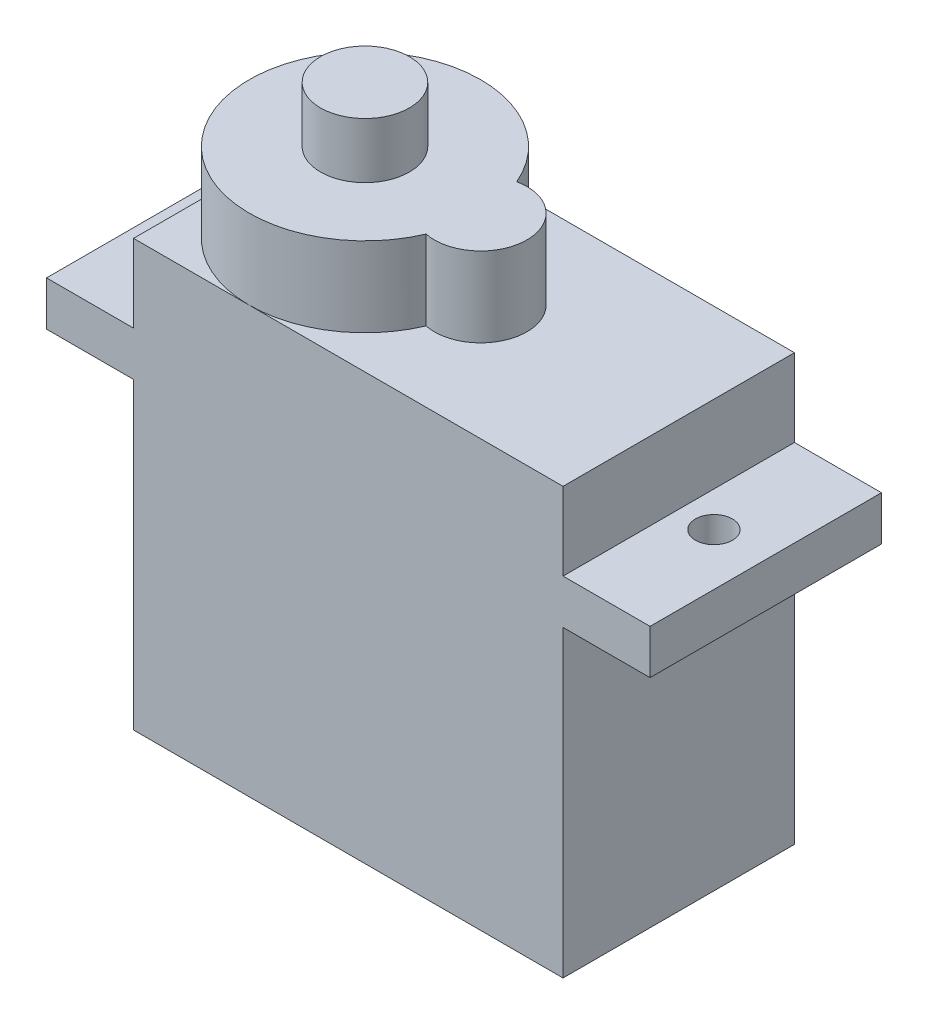
ISO-10303-21;
HEADER;
FILE_DESCRIPTION(('STEP AP214'),'2;1');
FILE_NAME('part.step','',(''),(''),'','','');
FILE_SCHEMA(('AUTOMOTIVE_DESIGN { 1 0 10303 214 1 1 1 1 }'));
ENDSEC;
DATA;
#1=APPLICATION_CONTEXT('core data for automotive mechanical design processes');
#2=APPLICATION_PROTOCOL_DEFINITION('international standard','automotive_design',2000,#1);
#3=PRODUCT_CONTEXT('',#1,'mechanical');
#4=PRODUCT('Part','Part','',(#3));
#5=PRODUCT_RELATED_PRODUCT_CATEGORY('part','',(#4));
#6=PRODUCT_DEFINITION_FORMATION('','',#4);
#7=PRODUCT_DEFINITION_CONTEXT('part definition',#1,'design');
#8=PRODUCT_DEFINITION('design','',#6,#7);
#9=PRODUCT_DEFINITION_SHAPE('','',#8);
#10=(LENGTH_UNIT() NAMED_UNIT(*) SI_UNIT(.MILLI.,.METRE.));
#11=(NAMED_UNIT(*) PLANE_ANGLE_UNIT() SI_UNIT($,.RADIAN.));
#12=(NAMED_UNIT(*) SI_UNIT($,.STERADIAN.) SOLID_ANGLE_UNIT());
#13=UNCERTAINTY_MEASURE_WITH_UNIT(LENGTH_MEASURE(1.E-05),#10,'distance_accuracy_value','');
#14=(GEOMETRIC_REPRESENTATION_CONTEXT(3) GLOBAL_UNCERTAINTY_ASSIGNED_CONTEXT((#13)) GLOBAL_UNIT_ASSIGNED_CONTEXT((#10,
#11,#12)) REPRESENTATION_CONTEXT('',''));
#15=CARTESIAN_POINT('',(0.,0.,0.));
#16=DIRECTION('',(0.,0.,1.));
#17=DIRECTION('',(1.,0.,0.));
#18=AXIS2_PLACEMENT_3D('',#15,#16,#17);
#19=CARTESIAN_POINT('',(0.,23.,0.));
#20=DIRECTION('',(0.,-1.,0.));
#21=DIRECTION('',(0.,0.,-1.));
#22=AXIS2_PLACEMENT_3D('',#19,#20,#21);
#23=PLANE('',#22);
#24=CARTESIAN_POINT('',(12.4999999999999,23.,-6.24999999999997));
#25=DIRECTION('',(0.,1.,0.));
#26=DIRECTION('',(0.,0.,1.));
#27=AXIS2_PLACEMENT_3D('',#24,#25,#26);
#28=CIRCLE('',#27,2.5);
#29=CARTESIAN_POINT('',(11.9999999999999,23.,-3.80051025721679));
#30=VERTEX_POINT('',#29);
#31=CARTESIAN_POINT('',(11.9999999999999,23.,-8.69948974278315));
#32=VERTEX_POINT('',#31);
#33=EDGE_CURVE('E166',#30,#32,#28,.T.);
#34=ORIENTED_EDGE('',*,*,#33,.F.);
#35=CARTESIAN_POINT('',(6.24999999999997,23.,-6.24999999999997));
#36=DIRECTION('',(0.,1.,0.));
#37=DIRECTION('',(0.,0.,1.));
#38=AXIS2_PLACEMENT_3D('',#35,#36,#37);
#39=CIRCLE('',#38,6.24999999999997);
#40=CARTESIAN_POINT('',(6.24999999999997,23.,0.));
#41=VERTEX_POINT('',#40);
#42=EDGE_CURVE('E276',#41,#30,#39,.T.);
#43=ORIENTED_EDGE('',*,*,#42,.F.);
#44=DIRECTION('',(1.,0.,0.));
#45=VECTOR('',#44,1.);
#46=CARTESIAN_POINT('',(0.,23.,0.));
#47=LINE('',#46,#45);
#48=CARTESIAN_POINT('',(23.2,23.,0.));
#49=VERTEX_POINT('',#48);
#50=EDGE_CURVE('E177',#41,#49,#47,.T.);
#51=ORIENTED_EDGE('',*,*,#50,.T.);
#52=DIRECTION('',(0.,0.,-1.));
#53=VECTOR('',#52,1.);
#54=CARTESIAN_POINT('',(23.2,23.,0.));
#55=LINE('',#54,#53);
#56=CARTESIAN_POINT('',(23.2,23.,-12.4999999999999));
#57=VERTEX_POINT('',#56);
#58=EDGE_CURVE('E182',#49,#57,#55,.T.);
#59=ORIENTED_EDGE('',*,*,#58,.T.);
#60=DIRECTION('',(-1.,0.,0.));
#61=VECTOR('',#60,1.);
#62=CARTESIAN_POINT('',(0.,23.,-12.4999999999999));
#63=LINE('',#62,#61);
#64=CARTESIAN_POINT('',(6.24999999999997,23.,-12.4999999999999));
#65=VERTEX_POINT('',#64);
#66=EDGE_CURVE('E185',#57,#65,#63,.T.);
#67=ORIENTED_EDGE('',*,*,#66,.T.);
#68=EDGE_CURVE('E53',#32,#65,#39,.T.);
#69=ORIENTED_EDGE('',*,*,#68,.F.);
#70=EDGE_LOOP('',(#34,#43,#51,#59,#67,#69));
#71=FACE_BOUND('',#70,.T.);
#72=ADVANCED_FACE('F38',(#71),#23,.F.);
#73=CARTESIAN_POINT('',(0.,23.,-6.24999999999997));
#74=VERTEX_POINT('',#73);
#75=EDGE_CURVE('E61',#65,#74,#39,.T.);
#76=ORIENTED_EDGE('',*,*,#75,.F.);
#77=CARTESIAN_POINT('',(0.,23.,-12.4999999999999));
#78=VERTEX_POINT('',#77);
#79=EDGE_CURVE('E184',#65,#78,#63,.T.);
#80=ORIENTED_EDGE('',*,*,#79,.T.);
#81=DIRECTION('',(0.,0.,1.));
#82=VECTOR('',#81,1.);
#83=CARTESIAN_POINT('',(0.,23.,0.));
#84=LINE('',#83,#82);
#85=EDGE_CURVE('E175',#78,#74,#84,.T.);
#86=ORIENTED_EDGE('',*,*,#85,.T.);
#87=EDGE_LOOP('',(#76,#80,#86));
#88=FACE_BOUND('',#87,.T.);
#89=ADVANCED_FACE('F318',(#88),#23,.F.);
#90=CARTESIAN_POINT('',(0.,18.8,0.));
#91=DIRECTION('',(0.,-1.,0.));
#92=DIRECTION('',(0.,0.,-1.));
#93=AXIS2_PLACEMENT_3D('',#90,#91,#92);
#94=PLANE('',#93);
#95=CARTESIAN_POINT('',(-1.9,18.8,-6.25000000000001));
#96=DIRECTION('',(0.,1.,0.));
#97=DIRECTION('',(0.,0.,1.));
#98=AXIS2_PLACEMENT_3D('',#95,#96,#97);
#99=CIRCLE('',#98,1.);
#100=CARTESIAN_POINT('',(-1.9,18.8,-5.25000000000001));
#101=VERTEX_POINT('',#100);
#102=EDGE_CURVE('E208',#101,#101,#99,.T.);
#103=ORIENTED_EDGE('',*,*,#102,.F.);
#104=EDGE_LOOP('',(#103));
#105=FACE_BOUND('',#104,.T.);
#106=DIRECTION('',(0.,0.,1.));
#107=VECTOR('',#106,1.);
#108=CARTESIAN_POINT('',(0.,18.8,0.));
#109=LINE('',#108,#107);
#110=CARTESIAN_POINT('',(0.,18.8,-12.4999999999999));
#111=VERTEX_POINT('',#110);
#112=CARTESIAN_POINT('',(0.,18.8,0.));
#113=VERTEX_POINT('',#112);
#114=EDGE_CURVE('E167',#111,#113,#109,.T.);
#115=ORIENTED_EDGE('',*,*,#114,.F.);
#116=DIRECTION('',(-1.,0.,0.));
#117=VECTOR('',#116,1.);
#118=CARTESIAN_POINT('',(-4.69999999999998,18.8,-12.4999999999999));
#119=LINE('',#118,#117);
#120=CARTESIAN_POINT('',(-4.69999999999998,18.8,-12.4999999999999));
#121=VERTEX_POINT('',#120);
#122=EDGE_CURVE('E223',#111,#121,#119,.T.);
#123=ORIENTED_EDGE('',*,*,#122,.T.);
#124=DIRECTION('',(0.,0.,1.));
#125=VECTOR('',#124,1.);
#126=CARTESIAN_POINT('',(-4.69999999999998,18.8,0.));
#127=LINE('',#126,#125);
#128=CARTESIAN_POINT('',(-4.69999999999998,18.8,0.));
#129=VERTEX_POINT('',#128);
#130=EDGE_CURVE('E214',#121,#129,#127,.T.);
#131=ORIENTED_EDGE('',*,*,#130,.T.);
#132=DIRECTION('',(1.,0.,0.));
#133=VECTOR('',#132,1.);
#134=CARTESIAN_POINT('',(-4.69999999999998,18.8,0.));
#135=LINE('',#134,#133);
#136=EDGE_CURVE('E219',#129,#113,#135,.T.);
#137=ORIENTED_EDGE('',*,*,#136,.T.);
#138=EDGE_LOOP('',(#115,#123,#131,#137));
#139=FACE_BOUND('',#138,.T.);
#140=ADVANCED_FACE('F311',(#105,#139),#94,.F.);
#141=CARTESIAN_POINT('',(25.1,18.8,-6.25000000000001));
#142=DIRECTION('',(0.,1.,0.));
#143=DIRECTION('',(0.,0.,1.));
#144=AXIS2_PLACEMENT_3D('',#141,#142,#143);
#145=CIRCLE('',#144,1.);
#146=CARTESIAN_POINT('',(25.1,18.8,-5.25));
#147=VERTEX_POINT('',#146);
#148=EDGE_CURVE('E202',#147,#147,#145,.T.);
#149=ORIENTED_EDGE('',*,*,#148,.F.);
#150=EDGE_LOOP('',(#149));
#151=FACE_BOUND('',#150,.T.);
#152=DIRECTION('',(0.,0.,-1.));
#153=VECTOR('',#152,1.);
#154=CARTESIAN_POINT('',(23.2,18.8,0.));
#155=LINE('',#154,#153);
#156=CARTESIAN_POINT('',(23.2,18.8,0.));
#157=VERTEX_POINT('',#156);
#158=CARTESIAN_POINT('',(23.2,18.8,-12.4999999999999));
#159=VERTEX_POINT('',#158);
#160=EDGE_CURVE('E170',#157,#159,#155,.T.);
#161=ORIENTED_EDGE('',*,*,#160,.F.);
#162=CARTESIAN_POINT('',(27.9,18.8,0.));
#163=VERTEX_POINT('',#162);
#164=EDGE_CURVE('E217',#157,#163,#135,.T.);
#165=ORIENTED_EDGE('',*,*,#164,.T.);
#166=DIRECTION('',(0.,0.,-1.));
#167=VECTOR('',#166,1.);
#168=CARTESIAN_POINT('',(27.9,18.8,0.));
#169=LINE('',#168,#167);
#170=CARTESIAN_POINT('',(27.9,18.8,-12.4999999999999));
#171=VERTEX_POINT('',#170);
#172=EDGE_CURVE('E221',#163,#171,#169,.T.);
#173=ORIENTED_EDGE('',*,*,#172,.T.);
#174=EDGE_CURVE('E224',#171,#159,#119,.T.);
#175=ORIENTED_EDGE('',*,*,#174,.T.);
#176=EDGE_LOOP('',(#161,#165,#173,#175));
#177=FACE_BOUND('',#176,.T.);
#178=ADVANCED_FACE('F287',(#151,#177),#94,.F.);
#179=CARTESIAN_POINT('',(0.,16.4,0.));
#180=DIRECTION('',(1.,0.,0.));
#181=DIRECTION('',(0.,0.,-1.));
#182=AXIS2_PLACEMENT_3D('',#179,#180,#181);
#183=PLANE('',#182);
#184=CARTESIAN_POINT('',(0.,5.,-5.23400000000001));
#185=DIRECTION('',(1.,0.,0.));
#186=DIRECTION('',(0.,0.,-1.));
#187=AXIS2_PLACEMENT_3D('',#184,#185,#186);
#188=CIRCLE('',#187,0.500000000000002);
#189=CARTESIAN_POINT('',(0.,5.,-5.73400000000001));
#190=VERTEX_POINT('',#189);
#191=EDGE_CURVE('E11',#190,#190,#188,.F.);
#192=ORIENTED_EDGE('',*,*,#191,.F.);
#193=EDGE_LOOP('',(#192));
#194=FACE_BOUND('',#193,.T.);
#195=CARTESIAN_POINT('',(0.,5.,-7.26600000000001));
#196=DIRECTION('',(1.,0.,0.));
#197=DIRECTION('',(0.,0.,-1.));
#198=AXIS2_PLACEMENT_3D('',#195,#196,#197);
#199=CIRCLE('',#198,0.500000000000002);
#200=CARTESIAN_POINT('',(0.,5.,-7.76600000000001));
#201=VERTEX_POINT('',#200);
#202=EDGE_CURVE('E46',#201,#201,#199,.F.);
#203=ORIENTED_EDGE('',*,*,#202,.F.);
#204=EDGE_LOOP('',(#203));
#205=FACE_BOUND('',#204,.T.);
#206=CARTESIAN_POINT('',(0.,5.,-6.25000000000001));
#207=DIRECTION('',(1.,0.,0.));
#208=DIRECTION('',(0.,0.,-1.));
#209=AXIS2_PLACEMENT_3D('',#206,#207,#208);
#210=CIRCLE('',#209,0.500000000000001);
#211=CARTESIAN_POINT('',(0.,5.,-6.75000000000001));
#212=VERTEX_POINT('',#211);
#213=EDGE_CURVE('E277',#212,#212,#210,.F.);
#214=ORIENTED_EDGE('',*,*,#213,.F.);
#215=EDGE_LOOP('',(#214));
#216=FACE_BOUND('',#215,.T.);
#217=DIRECTION('',(0.,0.,1.));
#218=VECTOR('',#217,1.);
#219=CARTESIAN_POINT('',(0.,0.,0.));
#220=LINE('',#219,#218);
#221=CARTESIAN_POINT('',(0.,0.,-12.5));
#222=VERTEX_POINT('',#221);
#223=CARTESIAN_POINT('',(0.,0.,0.));
#224=VERTEX_POINT('',#223);
#225=EDGE_CURVE('E249',#222,#224,#220,.T.);
#226=ORIENTED_EDGE('',*,*,#225,.T.);
#227=DIRECTION('',(0.,-1.,0.));
#228=VECTOR('',#227,1.);
#229=CARTESIAN_POINT('',(0.,16.4,0.));
#230=LINE('',#229,#228);
#231=CARTESIAN_POINT('',(0.,16.4,0.));
#232=VERTEX_POINT('',#231);
#233=EDGE_CURVE('E273',#232,#224,#230,.T.);
#234=ORIENTED_EDGE('',*,*,#233,.F.);
#235=DIRECTION('',(0.,0.,1.));
#236=VECTOR('',#235,1.);
#237=CARTESIAN_POINT('',(0.,16.4,0.));
#238=LINE('',#237,#236);
#239=CARTESIAN_POINT('',(0.,16.4,-12.5));
#240=VERTEX_POINT('',#239);
#241=EDGE_CURVE('E250',#240,#232,#238,.T.);
#242=ORIENTED_EDGE('',*,*,#241,.F.);
#243=DIRECTION('',(0.,-1.,0.));
#244=VECTOR('',#243,1.);
#245=CARTESIAN_POINT('',(0.,16.4,-12.5));
#246=LINE('',#245,#244);
#247=EDGE_CURVE('E257',#240,#222,#246,.T.);
#248=ORIENTED_EDGE('',*,*,#247,.T.);
#249=EDGE_LOOP('',(#226,#234,#242,#248));
#250=FACE_BOUND('',#249,.T.);
#251=ADVANCED_FACE('F40',(#194,#205,#216,#250),#183,.F.);
#252=CARTESIAN_POINT('',(0.,16.4,0.));
#253=DIRECTION('',(0.,0.,-1.));
#254=DIRECTION('',(-1.,0.,0.));
#255=AXIS2_PLACEMENT_3D('',#252,#253,#254);
#256=PLANE('',#255);
#257=DIRECTION('',(1.,0.,0.));
#258=VECTOR('',#257,1.);
#259=CARTESIAN_POINT('',(0.,0.,0.));
#260=LINE('',#259,#258);
#261=CARTESIAN_POINT('',(23.2,0.,0.));
#262=VERTEX_POINT('',#261);
#263=EDGE_CURVE('E260',#224,#262,#260,.T.);
#264=ORIENTED_EDGE('',*,*,#263,.T.);
#265=DIRECTION('',(0.,-1.,0.));
#266=VECTOR('',#265,1.);
#267=CARTESIAN_POINT('',(23.2,16.4,0.));
#268=LINE('',#267,#266);
#269=CARTESIAN_POINT('',(23.2,16.4,0.));
#270=VERTEX_POINT('',#269);
#271=EDGE_CURVE('E270',#270,#262,#268,.T.);
#272=ORIENTED_EDGE('',*,*,#271,.F.);
#273=DIRECTION('',(1.,0.,0.));
#274=VECTOR('',#273,1.);
#275=CARTESIAN_POINT('',(-4.69999999999998,16.4,0.));
#276=LINE('',#275,#274);
#277=CARTESIAN_POINT('',(27.9,16.4,0.));
#278=VERTEX_POINT('',#277);
#279=EDGE_CURVE('E229',#270,#278,#276,.T.);
#280=ORIENTED_EDGE('',*,*,#279,.T.);
#281=DIRECTION('',(0.,-1.,0.));
#282=VECTOR('',#281,1.);
#283=CARTESIAN_POINT('',(27.9,18.8,0.));
#284=LINE('',#283,#282);
#285=EDGE_CURVE('E243',#163,#278,#284,.T.);
#286=ORIENTED_EDGE('',*,*,#285,.F.);
#287=ORIENTED_EDGE('',*,*,#164,.F.);
#288=DIRECTION('',(0.,-1.,0.));
#289=VECTOR('',#288,1.);
#290=CARTESIAN_POINT('',(23.2,23.,0.));
#291=LINE('',#290,#289);
#292=EDGE_CURVE('E195',#49,#157,#291,.T.);
#293=ORIENTED_EDGE('',*,*,#292,.F.);
#294=ORIENTED_EDGE('',*,*,#50,.F.);
#295=CARTESIAN_POINT('',(0.,23.,0.));
#296=VERTEX_POINT('',#295);
#297=EDGE_CURVE('E179',#296,#41,#47,.T.);
#298=ORIENTED_EDGE('',*,*,#297,.F.);
#299=DIRECTION('',(0.,-1.,0.));
#300=VECTOR('',#299,1.);
#301=CARTESIAN_POINT('',(0.,23.,0.));
#302=LINE('',#301,#300);
#303=EDGE_CURVE('E198',#296,#113,#302,.T.);
#304=ORIENTED_EDGE('',*,*,#303,.T.);
#305=ORIENTED_EDGE('',*,*,#136,.F.);
#306=DIRECTION('',(0.,-1.,0.));
#307=VECTOR('',#306,1.);
#308=CARTESIAN_POINT('',(-4.69999999999998,18.8,0.));
#309=LINE('',#308,#307);
#310=CARTESIAN_POINT('',(-4.69999999999998,16.4,0.));
#311=VERTEX_POINT('',#310);
#312=EDGE_CURVE('E246',#129,#311,#309,.T.);
#313=ORIENTED_EDGE('',*,*,#312,.T.);
#314=EDGE_CURVE('E230',#311,#232,#276,.T.);
#315=ORIENTED_EDGE('',*,*,#314,.T.);
#316=ORIENTED_EDGE('',*,*,#233,.T.);
#317=EDGE_LOOP('',(#264,#272,#280,#286,#287,#293,#294,#298,#304,#305,#313,#315,#316));
#318=FACE_BOUND('',#317,.T.);
#319=ADVANCED_FACE('F286',(#318),#256,.F.);
#320=CARTESIAN_POINT('',(23.2,16.4,0.));
#321=DIRECTION('',(-1.,0.,0.));
#322=DIRECTION('',(0.,0.,1.));
#323=AXIS2_PLACEMENT_3D('',#320,#321,#322);
#324=PLANE('',#323);
#325=DIRECTION('',(0.,0.,-1.));
#326=VECTOR('',#325,1.);
#327=CARTESIAN_POINT('',(23.2,0.,0.));
#328=LINE('',#327,#326);
#329=CARTESIAN_POINT('',(23.2,0.,-12.5));
#330=VERTEX_POINT('',#329);
#331=EDGE_CURVE('E262',#262,#330,#328,.T.);
#332=ORIENTED_EDGE('',*,*,#331,.T.);
#333=DIRECTION('',(0.,-1.,0.));
#334=VECTOR('',#333,1.);
#335=CARTESIAN_POINT('',(23.2,16.4,-12.5));
#336=LINE('',#335,#334);
#337=CARTESIAN_POINT('',(23.2,16.4,-12.4999999999999));
#338=VERTEX_POINT('',#337);
#339=EDGE_CURVE('E267',#338,#330,#336,.T.);
#340=ORIENTED_EDGE('',*,*,#339,.F.);
#341=DIRECTION('',(0.,0.,-1.));
#342=VECTOR('',#341,1.);
#343=CARTESIAN_POINT('',(23.2,16.4,0.));
#344=LINE('',#343,#342);
#345=EDGE_CURVE('E253',#270,#338,#344,.T.);
#346=ORIENTED_EDGE('',*,*,#345,.F.);
#347=ORIENTED_EDGE('',*,*,#271,.T.);
#348=EDGE_LOOP('',(#332,#340,#346,#347));
#349=FACE_BOUND('',#348,.T.);
#350=ADVANCED_FACE('F370',(#349),#324,.F.);
#351=CARTESIAN_POINT('',(0.,16.4,-12.5));
#352=DIRECTION('',(0.,0.,1.));
#353=DIRECTION('',(1.,0.,0.));
#354=AXIS2_PLACEMENT_3D('',#351,#352,#353);
#355=PLANE('',#354);
#356=DIRECTION('',(-1.,0.,0.));
#357=VECTOR('',#356,1.);
#358=CARTESIAN_POINT('',(0.,0.,-12.5));
#359=LINE('',#358,#357);
#360=EDGE_CURVE('E254',#330,#222,#359,.T.);
#361=ORIENTED_EDGE('',*,*,#360,.T.);
#362=ORIENTED_EDGE('',*,*,#247,.F.);
#363=DIRECTION('',(-1.,0.,0.));
#364=VECTOR('',#363,1.);
#365=CARTESIAN_POINT('',(-4.69999999999998,16.4,-12.4999999999999));
#366=LINE('',#365,#364);
#367=CARTESIAN_POINT('',(-4.69999999999998,16.4,-12.4999999999999));
#368=VERTEX_POINT('',#367);
#369=EDGE_CURVE('E235',#240,#368,#366,.T.);
#370=ORIENTED_EDGE('',*,*,#369,.T.);
#371=DIRECTION('',(0.,-1.,0.));
#372=VECTOR('',#371,1.);
#373=CARTESIAN_POINT('',(-4.69999999999998,18.8,-12.4999999999999));
#374=LINE('',#373,#372);
#375=EDGE_CURVE('E226',#121,#368,#374,.T.);
#376=ORIENTED_EDGE('',*,*,#375,.F.);
#377=ORIENTED_EDGE('',*,*,#122,.F.);
#378=DIRECTION('',(0.,-1.,0.));
#379=VECTOR('',#378,1.);
#380=CARTESIAN_POINT('',(0.,23.,-12.4999999999999));
#381=LINE('',#380,#379);
#382=EDGE_CURVE('E186',#78,#111,#381,.T.);
#383=ORIENTED_EDGE('',*,*,#382,.F.);
#384=ORIENTED_EDGE('',*,*,#79,.F.);
#385=ORIENTED_EDGE('',*,*,#66,.F.);
#386=DIRECTION('',(0.,-1.,0.));
#387=VECTOR('',#386,1.);
#388=CARTESIAN_POINT('',(23.2,23.,-12.4999999999999));
#389=LINE('',#388,#387);
#390=EDGE_CURVE('E192',#57,#159,#389,.T.);
#391=ORIENTED_EDGE('',*,*,#390,.T.);
#392=ORIENTED_EDGE('',*,*,#174,.F.);
#393=DIRECTION('',(0.,-1.,0.));
#394=VECTOR('',#393,1.);
#395=CARTESIAN_POINT('',(27.9,18.8,-12.4999999999999));
#396=LINE('',#395,#394);
#397=CARTESIAN_POINT('',(27.9,16.4,-12.4999999999999));
#398=VERTEX_POINT('',#397);
#399=EDGE_CURVE('E240',#171,#398,#396,.T.);
#400=ORIENTED_EDGE('',*,*,#399,.T.);
#401=EDGE_CURVE('E218',#398,#338,#366,.T.);
#402=ORIENTED_EDGE('',*,*,#401,.T.);
#403=ORIENTED_EDGE('',*,*,#339,.T.);
#404=EDGE_LOOP('',(#361,#362,#370,#376,#377,#383,#384,#385,#391,#392,#400,#402,#403));
#405=FACE_BOUND('',#404,.T.);
#406=ADVANCED_FACE('F305',(#405),#355,.F.);
#407=CARTESIAN_POINT('',(0.,0.,0.));
#408=DIRECTION('',(0.,-1.,0.));
#409=DIRECTION('',(0.,0.,-1.));
#410=AXIS2_PLACEMENT_3D('',#407,#408,#409);
#411=PLANE('',#410);
#412=ORIENTED_EDGE('',*,*,#225,.F.);
#413=ORIENTED_EDGE('',*,*,#360,.F.);
#414=ORIENTED_EDGE('',*,*,#331,.F.);
#415=ORIENTED_EDGE('',*,*,#263,.F.);
#416=EDGE_LOOP('',(#412,#413,#414,#415));
#417=FACE_BOUND('',#416,.T.);
#418=ADVANCED_FACE('F295',(#417),#411,.T.);
#419=CARTESIAN_POINT('',(0.,16.4,0.));
#420=DIRECTION('',(0.,-1.,0.));
#421=DIRECTION('',(0.,0.,-1.));
#422=AXIS2_PLACEMENT_3D('',#419,#420,#421);
#423=PLANE('',#422);
#424=CARTESIAN_POINT('',(-1.9,16.4,-6.25000000000001));
#425=DIRECTION('',(0.,1.,0.));
#426=DIRECTION('',(0.,0.,1.));
#427=AXIS2_PLACEMENT_3D('',#424,#425,#426);
#428=CIRCLE('',#427,1.);
#429=CARTESIAN_POINT('',(-1.9,16.4,-5.25000000000001));
#430=VERTEX_POINT('',#429);
#431=EDGE_CURVE('E205',#430,#430,#428,.T.);
#432=ORIENTED_EDGE('',*,*,#431,.T.);
#433=EDGE_LOOP('',(#432));
#434=FACE_BOUND('',#433,.T.);
#435=ORIENTED_EDGE('',*,*,#369,.F.);
#436=ORIENTED_EDGE('',*,*,#241,.T.);
#437=ORIENTED_EDGE('',*,*,#314,.F.);
#438=DIRECTION('',(0.,0.,1.));
#439=VECTOR('',#438,1.);
#440=CARTESIAN_POINT('',(-4.69999999999998,16.4,0.));
#441=LINE('',#440,#439);
#442=EDGE_CURVE('E211',#368,#311,#441,.T.);
#443=ORIENTED_EDGE('',*,*,#442,.F.);
#444=EDGE_LOOP('',(#435,#436,#437,#443));
#445=FACE_BOUND('',#444,.T.);
#446=ADVANCED_FACE('F302',(#434,#445),#423,.T.);
#447=ORIENTED_EDGE('',*,*,#279,.F.);
#448=ORIENTED_EDGE('',*,*,#345,.T.);
#449=ORIENTED_EDGE('',*,*,#401,.F.);
#450=DIRECTION('',(0.,0.,-1.));
#451=VECTOR('',#450,1.);
#452=CARTESIAN_POINT('',(27.9,16.4,0.));
#453=LINE('',#452,#451);
#454=EDGE_CURVE('E233',#278,#398,#453,.T.);
#455=ORIENTED_EDGE('',*,*,#454,.F.);
#456=EDGE_LOOP('',(#447,#448,#449,#455));
#457=FACE_BOUND('',#456,.T.);
#458=CARTESIAN_POINT('',(25.1,16.4,-6.25000000000001));
#459=DIRECTION('',(0.,1.,0.));
#460=DIRECTION('',(0.,0.,1.));
#461=AXIS2_PLACEMENT_3D('',#458,#459,#460);
#462=CIRCLE('',#461,1.);
#463=CARTESIAN_POINT('',(25.1,16.4,-5.25));
#464=VERTEX_POINT('',#463);
#465=EDGE_CURVE('E201',#464,#464,#462,.T.);
#466=ORIENTED_EDGE('',*,*,#465,.T.);
#467=EDGE_LOOP('',(#466));
#468=FACE_BOUND('',#467,.T.);
#469=ADVANCED_FACE('F356',(#457,#468),#423,.T.);
#470=CARTESIAN_POINT('',(-4.69999999999998,18.8,0.));
#471=DIRECTION('',(1.,0.,0.));
#472=DIRECTION('',(0.,0.,-1.));
#473=AXIS2_PLACEMENT_3D('',#470,#471,#472);
#474=PLANE('',#473);
#475=ORIENTED_EDGE('',*,*,#442,.T.);
#476=ORIENTED_EDGE('',*,*,#312,.F.);
#477=ORIENTED_EDGE('',*,*,#130,.F.);
#478=ORIENTED_EDGE('',*,*,#375,.T.);
#479=EDGE_LOOP('',(#475,#476,#477,#478));
#480=FACE_BOUND('',#479,.T.);
#481=ADVANCED_FACE('F309',(#480),#474,.F.);
#482=CARTESIAN_POINT('',(27.9,18.8,0.));
#483=DIRECTION('',(-1.,0.,0.));
#484=DIRECTION('',(0.,0.,1.));
#485=AXIS2_PLACEMENT_3D('',#482,#483,#484);
#486=PLANE('',#485);
#487=ORIENTED_EDGE('',*,*,#454,.T.);
#488=ORIENTED_EDGE('',*,*,#399,.F.);
#489=ORIENTED_EDGE('',*,*,#172,.F.);
#490=ORIENTED_EDGE('',*,*,#285,.T.);
#491=EDGE_LOOP('',(#487,#488,#489,#490));
#492=FACE_BOUND('',#491,.T.);
#493=ADVANCED_FACE('F360',(#492),#486,.F.);
#494=CARTESIAN_POINT('',(-1.9,18.8,-6.25000000000001));
#495=DIRECTION('',(0.,-1.,0.));
#496=DIRECTION('',(0.,0.,-1.));
#497=AXIS2_PLACEMENT_3D('',#494,#495,#496);
#498=CYLINDRICAL_SURFACE('',#497,1.);
#499=ORIENTED_EDGE('',*,*,#102,.T.);
#500=EDGE_LOOP('',(#499));
#501=FACE_BOUND('',#500,.T.);
#502=ORIENTED_EDGE('',*,*,#431,.F.);
#503=EDGE_LOOP('',(#502));
#504=FACE_BOUND('',#503,.T.);
#505=ADVANCED_FACE('F354',(#501,#504),#498,.F.);
#506=CARTESIAN_POINT('',(25.1,18.8,-6.25000000000001));
#507=DIRECTION('',(0.,-1.,0.));
#508=DIRECTION('',(0.,0.,-1.));
#509=AXIS2_PLACEMENT_3D('',#506,#507,#508);
#510=CYLINDRICAL_SURFACE('',#509,1.);
#511=ORIENTED_EDGE('',*,*,#148,.T.);
#512=EDGE_LOOP('',(#511));
#513=FACE_BOUND('',#512,.T.);
#514=ORIENTED_EDGE('',*,*,#465,.F.);
#515=EDGE_LOOP('',(#514));
#516=FACE_BOUND('',#515,.T.);
#517=ADVANCED_FACE('F415',(#513,#516),#510,.F.);
#518=CARTESIAN_POINT('',(0.,23.,0.));
#519=DIRECTION('',(1.,0.,0.));
#520=DIRECTION('',(0.,0.,-1.));
#521=AXIS2_PLACEMENT_3D('',#518,#519,#520);
#522=PLANE('',#521);
#523=ORIENTED_EDGE('',*,*,#114,.T.);
#524=ORIENTED_EDGE('',*,*,#303,.F.);
#525=EDGE_CURVE('E178',#74,#296,#84,.T.);
#526=ORIENTED_EDGE('',*,*,#525,.F.);
#527=ORIENTED_EDGE('',*,*,#85,.F.);
#528=ORIENTED_EDGE('',*,*,#382,.T.);
#529=EDGE_LOOP('',(#523,#524,#526,#527,#528));
#530=FACE_BOUND('',#529,.T.);
#531=ADVANCED_FACE('F315',(#530),#522,.F.);
#532=CARTESIAN_POINT('',(23.2,23.,0.));
#533=DIRECTION('',(-1.,0.,0.));
#534=DIRECTION('',(0.,0.,1.));
#535=AXIS2_PLACEMENT_3D('',#532,#533,#534);
#536=PLANE('',#535);
#537=ORIENTED_EDGE('',*,*,#160,.T.);
#538=ORIENTED_EDGE('',*,*,#390,.F.);
#539=ORIENTED_EDGE('',*,*,#58,.F.);
#540=ORIENTED_EDGE('',*,*,#292,.T.);
#541=EDGE_LOOP('',(#537,#538,#539,#540));
#542=FACE_BOUND('',#541,.T.);
#543=ADVANCED_FACE('F331',(#542),#536,.F.);
#544=EDGE_CURVE('E320',#74,#41,#39,.T.);
#545=ORIENTED_EDGE('',*,*,#544,.F.);
#546=ORIENTED_EDGE('',*,*,#525,.T.);
#547=ORIENTED_EDGE('',*,*,#297,.T.);
#548=EDGE_LOOP('',(#545,#546,#547));
#549=FACE_BOUND('',#548,.T.);
#550=ADVANCED_FACE('F329',(#549),#23,.F.);
#551=CARTESIAN_POINT('',(12.4999999999999,27.3,-6.24999999999997));
#552=DIRECTION('',(0.,-1.,0.));
#553=DIRECTION('',(0.,0.,-1.));
#554=AXIS2_PLACEMENT_3D('',#551,#552,#553);
#555=CYLINDRICAL_SURFACE('',#554,2.5);
#556=ORIENTED_EDGE('',*,*,#33,.T.);
#557=DIRECTION('',(0.,-1.,0.));
#558=VECTOR('',#557,1.);
#559=CARTESIAN_POINT('',(11.9999999999999,27.3,-8.69948974278315));
#560=LINE('',#559,#558);
#561=CARTESIAN_POINT('',(11.9999999999999,27.3,-8.69948974278315));
#562=VERTEX_POINT('',#561);
#563=EDGE_CURVE('E153',#562,#32,#560,.T.);
#564=ORIENTED_EDGE('',*,*,#563,.F.);
#565=CARTESIAN_POINT('',(12.4999999999999,27.3,-6.24999999999997));
#566=DIRECTION('',(0.,1.,0.));
#567=DIRECTION('',(0.,0.,1.));
#568=AXIS2_PLACEMENT_3D('',#565,#566,#567);
#569=CIRCLE('',#568,2.5);
#570=CARTESIAN_POINT('',(11.9999999999999,27.3,-3.80051025721679));
#571=VERTEX_POINT('',#570);
#572=EDGE_CURVE('E160',#571,#562,#569,.T.);
#573=ORIENTED_EDGE('',*,*,#572,.F.);
#574=DIRECTION('',(0.,-1.,0.));
#575=VECTOR('',#574,1.);
#576=CARTESIAN_POINT('',(11.9999999999999,27.3,-3.80051025721679));
#577=LINE('',#576,#575);
#578=EDGE_CURVE('E157',#571,#30,#577,.T.);
#579=ORIENTED_EDGE('',*,*,#578,.T.);
#580=EDGE_LOOP('',(#556,#564,#573,#579));
#581=FACE_BOUND('',#580,.T.);
#582=ADVANCED_FACE('F165',(#581),#555,.T.);
#583=CARTESIAN_POINT('',(6.24999999999997,27.3,-6.24999999999997));
#584=DIRECTION('',(0.,-1.,0.));
#585=DIRECTION('',(0.,0.,-1.));
#586=AXIS2_PLACEMENT_3D('',#583,#584,#585);
#587=CYLINDRICAL_SURFACE('',#586,6.24999999999997);
#588=ORIENTED_EDGE('',*,*,#68,.T.);
#589=ORIENTED_EDGE('',*,*,#75,.T.);
#590=ORIENTED_EDGE('',*,*,#544,.T.);
#591=ORIENTED_EDGE('',*,*,#42,.T.);
#592=ORIENTED_EDGE('',*,*,#578,.F.);
#593=CARTESIAN_POINT('',(6.24999999999997,27.3,-6.24999999999997));
#594=DIRECTION('',(0.,1.,0.));
#595=DIRECTION('',(0.,0.,1.));
#596=AXIS2_PLACEMENT_3D('',#593,#594,#595);
#597=CIRCLE('',#596,6.24999999999997);
#598=EDGE_CURVE('E149',#562,#571,#597,.T.);
#599=ORIENTED_EDGE('',*,*,#598,.F.);
#600=ORIENTED_EDGE('',*,*,#563,.T.);
#601=EDGE_LOOP('',(#588,#589,#590,#591,#592,#599,#600));
#602=FACE_BOUND('',#601,.T.);
#603=ADVANCED_FACE('F151',(#602),#587,.T.);
#604=CARTESIAN_POINT('',(0.,27.3,0.));
#605=DIRECTION('',(0.,1.,0.));
#606=DIRECTION('',(0.,0.,1.));
#607=AXIS2_PLACEMENT_3D('',#604,#605,#606);
#608=PLANE('',#607);
#609=CARTESIAN_POINT('',(6.24999999999997,27.3,-6.24999999999997));
#610=DIRECTION('',(0.,1.,0.));
#611=DIRECTION('',(0.,0.,1.));
#612=AXIS2_PLACEMENT_3D('',#609,#610,#611);
#613=CIRCLE('',#612,2.400000026);
#614=CARTESIAN_POINT('',(6.24999999999997,27.3,-3.84999997399997));
#615=VERTEX_POINT('',#614);
#616=EDGE_CURVE('E588',#615,#615,#613,.T.);
#617=ORIENTED_EDGE('',*,*,#616,.F.);
#618=EDGE_LOOP('',(#617));
#619=FACE_BOUND('',#618,.T.);
#620=ORIENTED_EDGE('',*,*,#572,.T.);
#621=ORIENTED_EDGE('',*,*,#598,.T.);
#622=EDGE_LOOP('',(#620,#621));
#623=FACE_BOUND('',#622,.T.);
#624=ADVANCED_FACE('F162',(#619,#623),#608,.T.);
#625=CARTESIAN_POINT('',(6.24999999999997,30.3,-6.24999999999997));
#626=DIRECTION('',(0.,-1.,0.));
#627=DIRECTION('',(0.,0.,-1.));
#628=AXIS2_PLACEMENT_3D('',#625,#626,#627);
#629=CYLINDRICAL_SURFACE('',#628,2.400000026);
#630=CARTESIAN_POINT('',(6.24999999999997,30.3,-6.24999999999997));
#631=DIRECTION('',(0.,1.,0.));
#632=DIRECTION('',(0.,0.,1.));
#633=AXIS2_PLACEMENT_3D('',#630,#631,#632);
#634=CIRCLE('',#633,2.400000026);
#635=CARTESIAN_POINT('',(6.24999999999997,30.3,-3.84999997399997));
#636=VERTEX_POINT('',#635);
#637=EDGE_CURVE('E322',#636,#636,#634,.T.);
#638=ORIENTED_EDGE('',*,*,#637,.F.);
#639=EDGE_LOOP('',(#638));
#640=FACE_BOUND('',#639,.T.);
#641=ORIENTED_EDGE('',*,*,#616,.T.);
#642=EDGE_LOOP('',(#641));
#643=FACE_BOUND('',#642,.T.);
#644=ADVANCED_FACE('F472',(#640,#643),#629,.T.);
#645=CARTESIAN_POINT('',(6.24999999999997,30.3,-6.24999999999997));
#646=DIRECTION('',(0.,1.,0.));
#647=DIRECTION('',(0.,0.,1.));
#648=AXIS2_PLACEMENT_3D('',#645,#646,#647);
#649=PLANE('',#648);
#650=ORIENTED_EDGE('',*,*,#637,.T.);
#651=EDGE_LOOP('',(#650));
#652=FACE_BOUND('',#651,.T.);
#653=ADVANCED_FACE('F483',(#652),#649,.T.);
#654=CARTESIAN_POINT('',(-2.54,5.,-6.25000000000001));
#655=DIRECTION('',(1.,0.,0.));
#656=DIRECTION('',(0.,0.,-1.));
#657=AXIS2_PLACEMENT_3D('',#654,#655,#656);
#658=CYLINDRICAL_SURFACE('',#657,0.500000000000001);
#659=CARTESIAN_POINT('',(-2.54,5.,-6.25000000000001));
#660=DIRECTION('',(-1.,0.,0.));
#661=DIRECTION('',(0.,0.,1.));
#662=AXIS2_PLACEMENT_3D('',#659,#660,#661);
#663=CIRCLE('',#662,0.500000000000001);
#664=CARTESIAN_POINT('',(-2.54,5.,-5.75000000000001));
#665=VERTEX_POINT('',#664);
#666=EDGE_CURVE('E583',#665,#665,#663,.T.);
#667=ORIENTED_EDGE('',*,*,#666,.F.);
#668=EDGE_LOOP('',(#667));
#669=FACE_BOUND('',#668,.T.);
#670=ORIENTED_EDGE('',*,*,#213,.T.);
#671=EDGE_LOOP('',(#670));
#672=FACE_BOUND('',#671,.T.);
#673=ADVANCED_FACE('F494',(#669,#672),#658,.T.);
#674=CARTESIAN_POINT('',(-2.54,0.,0.));
#675=DIRECTION('',(-1.,0.,0.));
#676=DIRECTION('',(0.,0.,1.));
#677=AXIS2_PLACEMENT_3D('',#674,#675,#676);
#678=PLANE('',#677);
#679=ORIENTED_EDGE('',*,*,#666,.T.);
#680=EDGE_LOOP('',(#679));
#681=FACE_BOUND('',#680,.T.);
#682=ADVANCED_FACE('F511',(#681),#678,.T.);
#683=CARTESIAN_POINT('',(-2.54,5.,-7.26600000000001));
#684=DIRECTION('',(1.,0.,0.));
#685=DIRECTION('',(0.,0.,-1.));
#686=AXIS2_PLACEMENT_3D('',#683,#684,#685);
#687=CYLINDRICAL_SURFACE('',#686,0.500000000000002);
#688=CARTESIAN_POINT('',(-2.54,5.,-7.26600000000001));
#689=DIRECTION('',(-1.,0.,0.));
#690=DIRECTION('',(0.,0.,1.));
#691=AXIS2_PLACEMENT_3D('',#688,#689,#690);
#692=CIRCLE('',#691,0.500000000000002);
#693=CARTESIAN_POINT('',(-2.54,5.,-6.766));
#694=VERTEX_POINT('',#693);
#695=EDGE_CURVE('E580',#694,#694,#692,.T.);
#696=ORIENTED_EDGE('',*,*,#695,.F.);
#697=EDGE_LOOP('',(#696));
#698=FACE_BOUND('',#697,.T.);
#699=ORIENTED_EDGE('',*,*,#202,.T.);
#700=EDGE_LOOP('',(#699));
#701=FACE_BOUND('',#700,.T.);
#702=ADVANCED_FACE('F282',(#698,#701),#687,.T.);
#703=CARTESIAN_POINT('',(-2.54,0.,0.));
#704=DIRECTION('',(-1.,0.,0.));
#705=DIRECTION('',(0.,0.,1.));
#706=AXIS2_PLACEMENT_3D('',#703,#704,#705);
#707=PLANE('',#706);
#708=ORIENTED_EDGE('',*,*,#695,.T.);
#709=EDGE_LOOP('',(#708));
#710=FACE_BOUND('',#709,.T.);
#711=ADVANCED_FACE('F533',(#710),#707,.T.);
#712=CARTESIAN_POINT('',(-2.54,5.,-5.23400000000001));
#713=DIRECTION('',(1.,0.,0.));
#714=DIRECTION('',(0.,0.,-1.));
#715=AXIS2_PLACEMENT_3D('',#712,#713,#714);
#716=CYLINDRICAL_SURFACE('',#715,0.500000000000002);
#717=CARTESIAN_POINT('',(-2.54,5.,-5.23400000000001));
#718=DIRECTION('',(-1.,0.,0.));
#719=DIRECTION('',(0.,0.,1.));
#720=AXIS2_PLACEMENT_3D('',#717,#718,#719);
#721=CIRCLE('',#720,0.500000000000002);
#722=CARTESIAN_POINT('',(-2.54,5.,-4.734));
#723=VERTEX_POINT('',#722);
#724=EDGE_CURVE('E579',#723,#723,#721,.T.);
#725=ORIENTED_EDGE('',*,*,#724,.F.);
#726=EDGE_LOOP('',(#725));
#727=FACE_BOUND('',#726,.T.);
#728=ORIENTED_EDGE('',*,*,#191,.T.);
#729=EDGE_LOOP('',(#728));
#730=FACE_BOUND('',#729,.T.);
#731=ADVANCED_FACE('F544',(#727,#730),#716,.T.);
#732=CARTESIAN_POINT('',(-2.54,5.,-5.23400000000001));
#733=DIRECTION('',(-1.,0.,0.));
#734=DIRECTION('',(0.,0.,1.));
#735=AXIS2_PLACEMENT_3D('',#732,#733,#734);
#736=PLANE('',#735);
#737=ORIENTED_EDGE('',*,*,#724,.T.);
#738=EDGE_LOOP('',(#737));
#739=FACE_BOUND('',#738,.T.);
#740=ADVANCED_FACE('F555',(#739),#736,.T.);
#741=CLOSED_SHELL('',(#72,#89,#140,#178,#251,#319,#350,#406,#418,#446,#469,#481,#493,#505,#517,
#531,#543,#550,#582,#603,#624,#644,#653,#673,#682,#702,#711,#731,#740));
#742=MANIFOLD_SOLID_BREP('B2',#741);
#743=ADVANCED_BREP_SHAPE_REPRESENTATION('',(#18,#742),#14);
#744=SHAPE_DEFINITION_REPRESENTATION(#9,#743);
ENDSEC;
END-ISO-10303-21;
